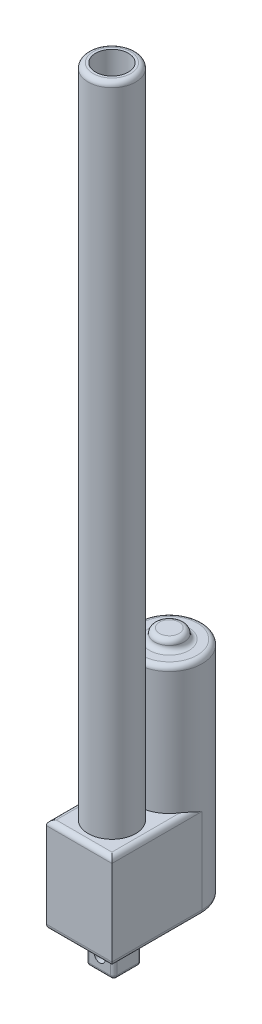
ISO-10303-21;
HEADER;
FILE_DESCRIPTION(('STEP AP214'),'2;1');
FILE_NAME('part.step','',(''),(''),'','','');
FILE_SCHEMA(('AUTOMOTIVE_DESIGN { 1 0 10303 214 1 1 1 1 }'));
ENDSEC;
DATA;
#1=APPLICATION_CONTEXT('core data for automotive mechanical design processes');
#2=APPLICATION_PROTOCOL_DEFINITION('international standard','automotive_design',2000,#1);
#3=PRODUCT_CONTEXT('',#1,'mechanical');
#4=PRODUCT('Part','Part','',(#3));
#5=PRODUCT_RELATED_PRODUCT_CATEGORY('part','',(#4));
#6=PRODUCT_DEFINITION_FORMATION('','',#4);
#7=PRODUCT_DEFINITION_CONTEXT('part definition',#1,'design');
#8=PRODUCT_DEFINITION('design','',#6,#7);
#9=PRODUCT_DEFINITION_SHAPE('','',#8);
#10=(LENGTH_UNIT() NAMED_UNIT(*) SI_UNIT(.MILLI.,.METRE.));
#11=(NAMED_UNIT(*) PLANE_ANGLE_UNIT() SI_UNIT($,.RADIAN.));
#12=(NAMED_UNIT(*) SI_UNIT($,.STERADIAN.) SOLID_ANGLE_UNIT());
#13=UNCERTAINTY_MEASURE_WITH_UNIT(LENGTH_MEASURE(1.E-05),#10,'distance_accuracy_value','');
#14=(GEOMETRIC_REPRESENTATION_CONTEXT(3) GLOBAL_UNCERTAINTY_ASSIGNED_CONTEXT((#13)) GLOBAL_UNIT_ASSIGNED_CONTEXT((#10,
#11,#12)) REPRESENTATION_CONTEXT('',''));
#15=CARTESIAN_POINT('',(0.,0.,0.));
#16=DIRECTION('',(0.,0.,1.));
#17=DIRECTION('',(1.,0.,0.));
#18=AXIS2_PLACEMENT_3D('',#15,#16,#17);
#19=CARTESIAN_POINT('',(0.,0.,0.));
#20=DIRECTION('',(0.,1.,0.));
#21=DIRECTION('',(0.,0.,1.));
#22=AXIS2_PLACEMENT_3D('',#19,#20,#21);
#23=PLANE('',#22);
#24=DIRECTION('',(0.,0.,1.));
#25=VECTOR('',#24,1.);
#26=CARTESIAN_POINT('',(-17.,0.,0.));
#27=LINE('',#26,#25);
#28=CARTESIAN_POINT('',(-17.,0.,52.));
#29=VERTEX_POINT('',#28);
#30=CARTESIAN_POINT('',(-17.,0.,0.));
#31=VERTEX_POINT('',#30);
#32=EDGE_CURVE('E378',#29,#31,#27,.F.);
#33=ORIENTED_EDGE('',*,*,#32,.T.);
#34=CARTESIAN_POINT('',(0.,0.,0.));
#35=DIRECTION('',(0.,1.,0.));
#36=DIRECTION('',(0.,0.,1.));
#37=AXIS2_PLACEMENT_3D('',#34,#35,#36);
#38=CIRCLE('',#37,17.);
#39=CARTESIAN_POINT('',(17.,0.,0.));
#40=VERTEX_POINT('',#39);
#41=EDGE_CURVE('E387',#31,#40,#38,.F.);
#42=ORIENTED_EDGE('',*,*,#41,.T.);
#43=DIRECTION('',(0.,0.,-1.));
#44=VECTOR('',#43,1.);
#45=CARTESIAN_POINT('',(17.,0.,0.));
#46=LINE('',#45,#44);
#47=CARTESIAN_POINT('',(17.,0.,52.));
#48=VERTEX_POINT('',#47);
#49=EDGE_CURVE('E385',#40,#48,#46,.F.);
#50=ORIENTED_EDGE('',*,*,#49,.T.);
#51=DIRECTION('',(1.,0.,0.));
#52=VECTOR('',#51,1.);
#53=CARTESIAN_POINT('',(0.,0.,52.));
#54=LINE('',#53,#52);
#55=EDGE_CURVE('E380',#48,#29,#54,.F.);
#56=ORIENTED_EDGE('',*,*,#55,.T.);
#57=EDGE_LOOP('',(#33,#42,#50,#56));
#58=FACE_BOUND('',#57,.T.);
#59=CARTESIAN_POINT('',(-5.40455096627243,0.,41.5));
#60=DIRECTION('',(0.,-1.,0.));
#61=DIRECTION('',(0.,0.,1.));
#62=AXIS2_PLACEMENT_3D('',#59,#60,#61);
#63=CIRCLE('',#62,2.);
#64=CARTESIAN_POINT('',(-5.40455096627242,0.,43.5));
#65=VERTEX_POINT('',#64);
#66=CARTESIAN_POINT('',(-7.40455096627243,0.,41.5));
#67=VERTEX_POINT('',#66);
#68=EDGE_CURVE('E167',#65,#67,#63,.T.);
#69=ORIENTED_EDGE('',*,*,#68,.F.);
#70=DIRECTION('',(-1.,0.,0.));
#71=VECTOR('',#70,1.);
#72=CARTESIAN_POINT('',(-5.40455096627242,0.,43.5));
#73=LINE('',#72,#71);
#74=CARTESIAN_POINT('',(7.59544903372756,0.,43.5));
#75=VERTEX_POINT('',#74);
#76=EDGE_CURVE('E172',#75,#65,#73,.T.);
#77=ORIENTED_EDGE('',*,*,#76,.F.);
#78=CARTESIAN_POINT('',(7.59544903372757,0.,41.5));
#79=DIRECTION('',(0.,-1.,0.));
#80=DIRECTION('',(0.,0.,-1.));
#81=AXIS2_PLACEMENT_3D('',#78,#79,#80);
#82=CIRCLE('',#81,2.);
#83=CARTESIAN_POINT('',(9.59544903372757,0.,41.5));
#84=VERTEX_POINT('',#83);
#85=EDGE_CURVE('E184',#84,#75,#82,.T.);
#86=ORIENTED_EDGE('',*,*,#85,.F.);
#87=DIRECTION('',(0.,0.,1.));
#88=VECTOR('',#87,1.);
#89=CARTESIAN_POINT('',(9.59544903372757,0.,41.5));
#90=LINE('',#89,#88);
#91=CARTESIAN_POINT('',(9.59544903372757,0.,28.5));
#92=VERTEX_POINT('',#91);
#93=EDGE_CURVE('E186',#92,#84,#90,.T.);
#94=ORIENTED_EDGE('',*,*,#93,.F.);
#95=CARTESIAN_POINT('',(7.59544903372757,0.,28.5));
#96=DIRECTION('',(0.,-1.,0.));
#97=DIRECTION('',(0.,0.,1.));
#98=AXIS2_PLACEMENT_3D('',#95,#96,#97);
#99=CIRCLE('',#98,2.);
#100=CARTESIAN_POINT('',(7.59544903372756,0.,26.5));
#101=VERTEX_POINT('',#100);
#102=EDGE_CURVE('E483',#101,#92,#99,.T.);
#103=ORIENTED_EDGE('',*,*,#102,.F.);
#104=DIRECTION('',(1.,0.,0.));
#105=VECTOR('',#104,1.);
#106=CARTESIAN_POINT('',(-5.40455096627242,0.,26.5));
#107=LINE('',#106,#105);
#108=CARTESIAN_POINT('',(-5.40455096627242,0.,26.5));
#109=VERTEX_POINT('',#108);
#110=EDGE_CURVE('E486',#109,#101,#107,.T.);
#111=ORIENTED_EDGE('',*,*,#110,.F.);
#112=CARTESIAN_POINT('',(-5.40455096627243,0.,28.5));
#113=DIRECTION('',(0.,-1.,0.));
#114=DIRECTION('',(0.,0.,1.));
#115=AXIS2_PLACEMENT_3D('',#112,#113,#114);
#116=CIRCLE('',#115,2.);
#117=CARTESIAN_POINT('',(-7.40455096627243,0.,28.5));
#118=VERTEX_POINT('',#117);
#119=EDGE_CURVE('E488',#118,#109,#116,.T.);
#120=ORIENTED_EDGE('',*,*,#119,.F.);
#121=DIRECTION('',(0.,0.,-1.));
#122=VECTOR('',#121,1.);
#123=CARTESIAN_POINT('',(-7.40455096627243,0.,41.5));
#124=LINE('',#123,#122);
#125=EDGE_CURVE('E181',#67,#118,#124,.T.);
#126=ORIENTED_EDGE('',*,*,#125,.F.);
#127=EDGE_LOOP('',(#69,#77,#86,#94,#103,#111,#120,#126));
#128=FACE_BOUND('',#127,.T.);
#129=ADVANCED_FACE('F38',(#58,#128),#23,.F.);
#130=CARTESIAN_POINT('',(0.,58.,0.));
#131=DIRECTION('',(0.,-1.,0.));
#132=DIRECTION('',(0.,0.,-1.));
#133=AXIS2_PLACEMENT_3D('',#130,#131,#132);
#134=CYLINDRICAL_SURFACE('',#133,20.);
#135=CARTESIAN_POINT('',(0.,133.,0.));
#136=DIRECTION('',(0.,1.,0.));
#137=DIRECTION('',(0.,0.,1.));
#138=AXIS2_PLACEMENT_3D('',#135,#136,#137);
#139=CIRCLE('',#138,20.);
#140=CARTESIAN_POINT('',(0.,133.,20.));
#141=VERTEX_POINT('',#140);
#142=EDGE_CURVE('E409',#141,#141,#139,.F.);
#143=ORIENTED_EDGE('',*,*,#142,.T.);
#144=EDGE_LOOP('',(#143));
#145=FACE_BOUND('',#144,.T.);
#146=DIRECTION('',(0.,-1.,0.));
#147=VECTOR('',#146,1.);
#148=CARTESIAN_POINT('',(20.,58.,0.));
#149=LINE('',#148,#147);
#150=CARTESIAN_POINT('',(20.,55.,0.));
#151=VERTEX_POINT('',#150);
#152=CARTESIAN_POINT('',(20.,3.00000000000002,0.));
#153=VERTEX_POINT('',#152);
#154=EDGE_CURVE('E214',#151,#153,#149,.T.);
#155=ORIENTED_EDGE('',*,*,#154,.T.);
#156=CARTESIAN_POINT('',(0.,3.,0.));
#157=DIRECTION('',(0.,1.,0.));
#158=DIRECTION('',(0.,0.,1.));
#159=AXIS2_PLACEMENT_3D('',#156,#157,#158);
#160=CIRCLE('',#159,20.);
#161=CARTESIAN_POINT('',(-20.,3.00000000000002,0.));
#162=VERTEX_POINT('',#161);
#163=EDGE_CURVE('E374',#153,#162,#160,.T.);
#164=ORIENTED_EDGE('',*,*,#163,.T.);
#165=DIRECTION('',(0.,-1.,0.));
#166=VECTOR('',#165,1.);
#167=CARTESIAN_POINT('',(-20.,58.,0.));
#168=LINE('',#167,#166);
#169=CARTESIAN_POINT('',(-20.,55.,0.));
#170=VERTEX_POINT('',#169);
#171=EDGE_CURVE('E219',#170,#162,#168,.T.);
#172=ORIENTED_EDGE('',*,*,#171,.F.);
#173=CARTESIAN_POINT('',(-17.,58.,10.5356537528527));
#174=CARTESIAN_POINT('',(-17.0895448022673,57.9999782410106,10.3911760778153));
#175=CARTESIAN_POINT('',(-17.1772185302614,57.995992018961,10.2455863992191));
#176=CARTESIAN_POINT('',(-17.3486422294934,57.9809194274149,9.95255556602213));
#177=CARTESIAN_POINT('',(-17.4323938846708,57.9698361355971,9.80511524112177));
#178=CARTESIAN_POINT('',(-17.5956876618835,57.9414283994052,9.50896002125828));
#179=CARTESIAN_POINT('',(-17.675238743086,57.9241179088912,9.36024869594975));
#180=CARTESIAN_POINT('',(-17.8302672611487,57.8839326824874,9.0614516431863));
#181=CARTESIAN_POINT('',(-17.9057441981785,57.8610572657603,8.91136574972452));
#182=CARTESIAN_POINT('',(-18.1251502858539,57.7853030348798,8.46108504584103));
#183=CARTESIAN_POINT('',(-18.2630104972366,57.7251149668963,8.15913048456194));
#184=CARTESIAN_POINT('',(-18.5224881765929,57.5891109541304,7.55160111752511));
#185=CARTESIAN_POINT('',(-18.6440929993286,57.513282958146,7.24602369236116));
#186=CARTESIAN_POINT('',(-18.8490527869545,57.3651060229508,6.69198454232564));
#187=CARTESIAN_POINT('',(-18.9352466017832,57.2949501669699,6.44397665599419));
#188=CARTESIAN_POINT('',(-19.0972922428552,57.1478676851181,5.94658382503359));
#189=CARTESIAN_POINT('',(-19.1731428622616,57.0709402708668,5.6971987232381));
#190=CARTESIAN_POINT('',(-19.3854166699556,56.8317433902614,4.94728357596335));
#191=CARTESIAN_POINT('',(-19.5065484481745,56.6610693305168,4.44502999160686));
#192=CARTESIAN_POINT('',(-19.709172391863,56.3047789821685,3.43705349427391));
#193=CARTESIAN_POINT('',(-19.7905979120841,56.1191381768188,2.93132618336807));
#194=CARTESIAN_POINT('',(-19.9142998143184,55.7393940275859,1.91852913864081));
#195=CARTESIAN_POINT('',(-19.9565950479971,55.5452948059293,1.41146016939251));
#196=CARTESIAN_POINT('',(-19.9927901364862,55.2368646054805,0.611622144785783));
#197=CARTESIAN_POINT('',(-19.9995967530798,55.1235441690785,0.318990849644172));
#198=CARTESIAN_POINT('',(-19.9999942018716,55.0068100482986,0.017583467208841));
#199=CARTESIAN_POINT('',(-19.9999999988693,55.0034050213477,0.00879172538854799));
#200=CARTESIAN_POINT('',(-20.,55.,0.));
#201=B_SPLINE_CURVE_WITH_KNOTS('',3,(#173,#174,#175,#176,#177,#178,#179,#180,#181,#182,#183,
#184,#185,#186,#187,#188,#189,#190,#191,#192,#193,#194,#195,#196,#197,#198,#199,#200),
.UNSPECIFIED.,.F.,.F.,(4,2,2,2,2,2,2,2,2,2,2,2,2,4),(0.,0.509811439877447,1.01940194713635,
1.52785760886553,2.03637550860506,3.04745631521841,4.05931913100926,4.87432922119133,
5.68943432496279,7.31976401305429,8.95282080045307,10.5850904253084,11.5264747571759,
11.5547590337701),.UNSPECIFIED.);
#202=CARTESIAN_POINT('',(-17.,58.,10.5356537528527));
#203=VERTEX_POINT('',#202);
#204=EDGE_CURVE('E250',#170,#203,#201,.F.);
#205=ORIENTED_EDGE('',*,*,#204,.T.);
#206=CARTESIAN_POINT('',(0.,58.,0.));
#207=DIRECTION('',(0.,1.,0.));
#208=DIRECTION('',(0.,0.,1.));
#209=AXIS2_PLACEMENT_3D('',#206,#207,#208);
#210=CIRCLE('',#209,20.);
#211=CARTESIAN_POINT('',(17.,58.,10.5356537528527));
#212=VERTEX_POINT('',#211);
#213=EDGE_CURVE('E215',#203,#212,#210,.T.);
#214=ORIENTED_EDGE('',*,*,#213,.T.);
#215=CARTESIAN_POINT('',(17.,58.,10.5356537528527));
#216=CARTESIAN_POINT('',(17.0895448022673,57.9999782410106,10.3911760778153));
#217=CARTESIAN_POINT('',(17.1772185302614,57.995992018961,10.2455863992191));
#218=CARTESIAN_POINT('',(17.3486422294934,57.9809194274149,9.95255556602213));
#219=CARTESIAN_POINT('',(17.4323938846708,57.9698361355971,9.80511524112177));
#220=CARTESIAN_POINT('',(17.5956876618835,57.9414283994052,9.50896002125828));
#221=CARTESIAN_POINT('',(17.675238743086,57.9241179088912,9.36024869594975));
#222=CARTESIAN_POINT('',(17.8302672611487,57.8839326824874,9.0614516431863));
#223=CARTESIAN_POINT('',(17.9057441981785,57.8610572657603,8.91136574972452));
#224=CARTESIAN_POINT('',(18.1251502858539,57.7853030348798,8.46108504584103));
#225=CARTESIAN_POINT('',(18.2630104972366,57.7251149668963,8.15913048456194));
#226=CARTESIAN_POINT('',(18.5224881765929,57.5891109541304,7.55160111752511));
#227=CARTESIAN_POINT('',(18.6440929993286,57.513282958146,7.24602369236116));
#228=CARTESIAN_POINT('',(18.8490527869545,57.3651060229508,6.69198454232564));
#229=CARTESIAN_POINT('',(18.9352466017832,57.2949501669699,6.44397665599419));
#230=CARTESIAN_POINT('',(19.0972922428552,57.1478676851181,5.94658382503359));
#231=CARTESIAN_POINT('',(19.1731428622616,57.0709402708668,5.6971987232381));
#232=CARTESIAN_POINT('',(19.3854166699556,56.8317433902614,4.94728357596335));
#233=CARTESIAN_POINT('',(19.5065484481745,56.6610693305168,4.44502999160686));
#234=CARTESIAN_POINT('',(19.709172391863,56.3047789821685,3.43705349427391));
#235=CARTESIAN_POINT('',(19.7905979120841,56.1191381768188,2.93132618336807));
#236=CARTESIAN_POINT('',(19.9142998143184,55.7393940275859,1.91852913864081));
#237=CARTESIAN_POINT('',(19.9565950479971,55.5452948059293,1.41146016939251));
#238=CARTESIAN_POINT('',(19.9927901364862,55.2368646054805,0.611622144785783));
#239=CARTESIAN_POINT('',(19.9995967530798,55.1235441690785,0.318990849644172));
#240=CARTESIAN_POINT('',(19.9999942018716,55.0068100482986,0.017583467208841));
#241=CARTESIAN_POINT('',(19.9999999988693,55.0034050213477,0.00879172538854799));
#242=CARTESIAN_POINT('',(20.,55.,0.));
#243=B_SPLINE_CURVE_WITH_KNOTS('',3,(#215,#216,#217,#218,#219,#220,#221,#222,#223,#224,#225,
#226,#227,#228,#229,#230,#231,#232,#233,#234,#235,#236,#237,#238,#239,#240,#241,#242),
.UNSPECIFIED.,.F.,.F.,(4,2,2,2,2,2,2,2,2,2,2,2,2,4),(0.,0.509811439877447,1.01940194713635,
1.52785760886553,2.03637550860506,3.04745631521841,4.05931913100926,4.87432922119133,
5.68943432496279,7.31976401305429,8.95282080045307,10.5850904253084,11.5264747571759,
11.5547590337701),.UNSPECIFIED.);
#244=EDGE_CURVE('E242',#212,#151,#243,.T.);
#245=ORIENTED_EDGE('',*,*,#244,.T.);
#246=EDGE_LOOP('',(#155,#164,#172,#205,#214,#245));
#247=FACE_BOUND('',#246,.T.);
#248=ADVANCED_FACE('F257',(#145,#247),#134,.T.);
#249=CARTESIAN_POINT('',(-20.,58.,0.));
#250=DIRECTION('',(1.,0.,0.));
#251=DIRECTION('',(0.,0.,-1.));
#252=AXIS2_PLACEMENT_3D('',#249,#250,#251);
#253=PLANE('',#252);
#254=ORIENTED_EDGE('',*,*,#171,.T.);
#255=DIRECTION('',(0.,0.,1.));
#256=VECTOR('',#255,1.);
#257=CARTESIAN_POINT('',(-20.,3.,0.));
#258=LINE('',#257,#256);
#259=CARTESIAN_POINT('',(-20.,3.00000000000002,55.));
#260=VERTEX_POINT('',#259);
#261=EDGE_CURVE('E367',#162,#260,#258,.T.);
#262=ORIENTED_EDGE('',*,*,#261,.T.);
#263=DIRECTION('',(0.,-1.,0.));
#264=VECTOR('',#263,1.);
#265=CARTESIAN_POINT('',(-20.,58.,55.));
#266=LINE('',#265,#264);
#267=CARTESIAN_POINT('',(-20.,55.,55.));
#268=VERTEX_POINT('',#267);
#269=EDGE_CURVE('E225',#268,#260,#266,.T.);
#270=ORIENTED_EDGE('',*,*,#269,.F.);
#271=DIRECTION('',(0.,0.,1.));
#272=VECTOR('',#271,1.);
#273=CARTESIAN_POINT('',(-20.,55.,0.));
#274=LINE('',#273,#272);
#275=EDGE_CURVE('E240',#268,#170,#274,.F.);
#276=ORIENTED_EDGE('',*,*,#275,.T.);
#277=EDGE_LOOP('',(#254,#262,#270,#276));
#278=FACE_BOUND('',#277,.T.);
#279=ADVANCED_FACE('F346',(#278),#253,.F.);
#280=CARTESIAN_POINT('',(-20.,58.,55.));
#281=DIRECTION('',(0.,0.,-1.));
#282=DIRECTION('',(-1.,0.,0.));
#283=AXIS2_PLACEMENT_3D('',#280,#281,#282);
#284=PLANE('',#283);
#285=ORIENTED_EDGE('',*,*,#269,.T.);
#286=DIRECTION('',(1.,0.,0.));
#287=VECTOR('',#286,1.);
#288=CARTESIAN_POINT('',(-20.,3.,55.));
#289=LINE('',#288,#287);
#290=CARTESIAN_POINT('',(20.,3.00000000000002,55.));
#291=VERTEX_POINT('',#290);
#292=EDGE_CURVE('E392',#260,#291,#289,.T.);
#293=ORIENTED_EDGE('',*,*,#292,.T.);
#294=DIRECTION('',(0.,-1.,0.));
#295=VECTOR('',#294,1.);
#296=CARTESIAN_POINT('',(20.,58.,55.));
#297=LINE('',#296,#295);
#298=CARTESIAN_POINT('',(20.,55.,55.));
#299=VERTEX_POINT('',#298);
#300=EDGE_CURVE('E222',#299,#291,#297,.T.);
#301=ORIENTED_EDGE('',*,*,#300,.F.);
#302=DIRECTION('',(1.,0.,0.));
#303=VECTOR('',#302,1.);
#304=CARTESIAN_POINT('',(-20.,55.,55.));
#305=LINE('',#304,#303);
#306=EDGE_CURVE('E236',#299,#268,#305,.F.);
#307=ORIENTED_EDGE('',*,*,#306,.T.);
#308=EDGE_LOOP('',(#285,#293,#301,#307));
#309=FACE_BOUND('',#308,.T.);
#310=ADVANCED_FACE('F355',(#309),#284,.F.);
#311=CARTESIAN_POINT('',(20.,58.,0.));
#312=DIRECTION('',(-1.,0.,0.));
#313=DIRECTION('',(0.,0.,1.));
#314=AXIS2_PLACEMENT_3D('',#311,#312,#313);
#315=PLANE('',#314);
#316=ORIENTED_EDGE('',*,*,#300,.T.);
#317=DIRECTION('',(0.,0.,-1.));
#318=VECTOR('',#317,1.);
#319=CARTESIAN_POINT('',(20.,3.,0.));
#320=LINE('',#319,#318);
#321=EDGE_CURVE('E390',#291,#153,#320,.T.);
#322=ORIENTED_EDGE('',*,*,#321,.T.);
#323=ORIENTED_EDGE('',*,*,#154,.F.);
#324=DIRECTION('',(0.,0.,-1.));
#325=VECTOR('',#324,1.);
#326=CARTESIAN_POINT('',(20.,55.,55.));
#327=LINE('',#326,#325);
#328=EDGE_CURVE('E238',#151,#299,#327,.F.);
#329=ORIENTED_EDGE('',*,*,#328,.T.);
#330=EDGE_LOOP('',(#316,#322,#323,#329));
#331=FACE_BOUND('',#330,.T.);
#332=ADVANCED_FACE('F352',(#331),#315,.F.);
#333=CARTESIAN_POINT('',(0.,58.,0.));
#334=DIRECTION('',(0.,1.,0.));
#335=DIRECTION('',(0.,0.,1.));
#336=AXIS2_PLACEMENT_3D('',#333,#334,#335);
#337=PLANE('',#336);
#338=CARTESIAN_POINT('',(0.,58.,35.));
#339=DIRECTION('',(0.,1.,0.));
#340=DIRECTION('',(0.,0.,1.));
#341=AXIS2_PLACEMENT_3D('',#338,#339,#340);
#342=CIRCLE('',#341,14.5);
#343=CARTESIAN_POINT('',(0.,58.,49.5));
#344=VERTEX_POINT('',#343);
#345=EDGE_CURVE('E207',#344,#344,#342,.T.);
#346=ORIENTED_EDGE('',*,*,#345,.F.);
#347=EDGE_LOOP('',(#346));
#348=FACE_BOUND('',#347,.T.);
#349=DIRECTION('',(1.,0.,0.));
#350=VECTOR('',#349,1.);
#351=CARTESIAN_POINT('',(20.,58.,52.));
#352=LINE('',#351,#350);
#353=CARTESIAN_POINT('',(-17.,58.,52.));
#354=VERTEX_POINT('',#353);
#355=CARTESIAN_POINT('',(17.,58.,52.));
#356=VERTEX_POINT('',#355);
#357=EDGE_CURVE('E231',#354,#356,#352,.T.);
#358=ORIENTED_EDGE('',*,*,#357,.T.);
#359=DIRECTION('',(0.,0.,-1.));
#360=VECTOR('',#359,1.);
#361=CARTESIAN_POINT('',(17.,58.,0.));
#362=LINE('',#361,#360);
#363=EDGE_CURVE('E234',#356,#212,#362,.T.);
#364=ORIENTED_EDGE('',*,*,#363,.T.);
#365=ORIENTED_EDGE('',*,*,#213,.F.);
#366=DIRECTION('',(0.,0.,1.));
#367=VECTOR('',#366,1.);
#368=CARTESIAN_POINT('',(-17.,58.,55.));
#369=LINE('',#368,#367);
#370=EDGE_CURVE('E218',#203,#354,#369,.T.);
#371=ORIENTED_EDGE('',*,*,#370,.T.);
#372=EDGE_LOOP('',(#358,#364,#365,#371));
#373=FACE_BOUND('',#372,.T.);
#374=ADVANCED_FACE('F350',(#348,#373),#337,.T.);
#375=CARTESIAN_POINT('',(0.,136.,0.));
#376=DIRECTION('',(0.,1.,0.));
#377=DIRECTION('',(0.,0.,1.));
#378=AXIS2_PLACEMENT_3D('',#375,#376,#377);
#379=PLANE('',#378);
#380=CARTESIAN_POINT('',(0.,136.,0.));
#381=DIRECTION('',(0.,1.,0.));
#382=DIRECTION('',(0.,0.,1.));
#383=AXIS2_PLACEMENT_3D('',#380,#381,#382);
#384=CIRCLE('',#383,12.);
#385=CARTESIAN_POINT('',(0.,136.,12.));
#386=VERTEX_POINT('',#385);
#387=EDGE_CURVE('E415',#386,#386,#384,.F.);
#388=ORIENTED_EDGE('',*,*,#387,.T.);
#389=EDGE_LOOP('',(#388));
#390=FACE_BOUND('',#389,.T.);
#391=CARTESIAN_POINT('',(0.,136.,0.));
#392=DIRECTION('',(0.,1.,0.));
#393=DIRECTION('',(0.,0.,1.));
#394=AXIS2_PLACEMENT_3D('',#391,#392,#393);
#395=CIRCLE('',#394,17.);
#396=CARTESIAN_POINT('',(0.,136.,17.));
#397=VERTEX_POINT('',#396);
#398=EDGE_CURVE('E395',#397,#397,#395,.T.);
#399=ORIENTED_EDGE('',*,*,#398,.T.);
#400=EDGE_LOOP('',(#399));
#401=FACE_BOUND('',#400,.T.);
#402=ADVANCED_FACE('F548',(#390,#401),#379,.T.);
#403=CARTESIAN_POINT('',(0.,458.,35.));
#404=DIRECTION('',(0.,-1.,0.));
#405=DIRECTION('',(0.,0.,-1.));
#406=AXIS2_PLACEMENT_3D('',#403,#404,#405);
#407=CYLINDRICAL_SURFACE('',#406,14.5);
#408=CARTESIAN_POINT('',(0.,455.,35.));
#409=DIRECTION('',(0.,1.,0.));
#410=DIRECTION('',(0.,0.,1.));
#411=AXIS2_PLACEMENT_3D('',#408,#409,#410);
#412=CIRCLE('',#411,14.5);
#413=CARTESIAN_POINT('',(0.,455.,49.5));
#414=VERTEX_POINT('',#413);
#415=EDGE_CURVE('E423',#414,#414,#412,.F.);
#416=ORIENTED_EDGE('',*,*,#415,.T.);
#417=EDGE_LOOP('',(#416));
#418=FACE_BOUND('',#417,.T.);
#419=ORIENTED_EDGE('',*,*,#345,.T.);
#420=EDGE_LOOP('',(#419));
#421=FACE_BOUND('',#420,.T.);
#422=ADVANCED_FACE('F545',(#418,#421),#407,.T.);
#423=CARTESIAN_POINT('',(0.,458.,35.));
#424=DIRECTION('',(0.,1.,0.));
#425=DIRECTION('',(0.,0.,1.));
#426=AXIS2_PLACEMENT_3D('',#423,#424,#425);
#427=PLANE('',#426);
#428=CARTESIAN_POINT('',(0.,458.,35.));
#429=DIRECTION('',(0.,1.,0.));
#430=DIRECTION('',(0.,0.,1.));
#431=AXIS2_PLACEMENT_3D('',#428,#429,#430);
#432=CIRCLE('',#431,11.5);
#433=CARTESIAN_POINT('',(0.,458.,46.5));
#434=VERTEX_POINT('',#433);
#435=EDGE_CURVE('E418',#434,#434,#432,.T.);
#436=ORIENTED_EDGE('',*,*,#435,.T.);
#437=EDGE_LOOP('',(#436));
#438=FACE_BOUND('',#437,.T.);
#439=CARTESIAN_POINT('',(0.,458.,35.));
#440=DIRECTION('',(0.,1.,0.));
#441=DIRECTION('',(0.,0.,1.));
#442=AXIS2_PLACEMENT_3D('',#439,#440,#441);
#443=CIRCLE('',#442,10.);
#444=CARTESIAN_POINT('',(0.,458.,45.));
#445=VERTEX_POINT('',#444);
#446=EDGE_CURVE('E208',#445,#445,#443,.T.);
#447=ORIENTED_EDGE('',*,*,#446,.F.);
#448=EDGE_LOOP('',(#447));
#449=FACE_BOUND('',#448,.T.);
#450=ADVANCED_FACE('F541',(#438,#449),#427,.T.);
#451=CARTESIAN_POINT('',(0.,158.,35.));
#452=DIRECTION('',(0.,1.,0.));
#453=DIRECTION('',(0.,0.,1.));
#454=AXIS2_PLACEMENT_3D('',#451,#452,#453);
#455=CYLINDRICAL_SURFACE('',#454,10.);
#456=CARTESIAN_POINT('',(0.,158.,35.));
#457=DIRECTION('',(0.,1.,0.));
#458=DIRECTION('',(0.,0.,1.));
#459=AXIS2_PLACEMENT_3D('',#456,#457,#458);
#460=CIRCLE('',#459,10.);
#461=CARTESIAN_POINT('',(0.,158.,45.));
#462=VERTEX_POINT('',#461);
#463=EDGE_CURVE('E204',#462,#462,#460,.T.);
#464=ORIENTED_EDGE('',*,*,#463,.F.);
#465=EDGE_LOOP('',(#464));
#466=FACE_BOUND('',#465,.T.);
#467=ORIENTED_EDGE('',*,*,#446,.T.);
#468=EDGE_LOOP('',(#467));
#469=FACE_BOUND('',#468,.T.);
#470=ADVANCED_FACE('F537',(#466,#469),#455,.F.);
#471=CARTESIAN_POINT('',(0.,158.,35.));
#472=DIRECTION('',(0.,1.,0.));
#473=DIRECTION('',(0.,0.,1.));
#474=AXIS2_PLACEMENT_3D('',#471,#472,#473);
#475=PLANE('',#474);
#476=ORIENTED_EDGE('',*,*,#463,.T.);
#477=EDGE_LOOP('',(#476));
#478=FACE_BOUND('',#477,.T.);
#479=ADVANCED_FACE('F270',(#478),#475,.T.);
#480=CARTESIAN_POINT('',(-17.,55.,0.));
#481=DIRECTION('',(0.,0.,-1.));
#482=DIRECTION('',(-1.,0.,0.));
#483=AXIS2_PLACEMENT_3D('',#480,#481,#482);
#484=CYLINDRICAL_SURFACE('',#483,3.);
#485=ORIENTED_EDGE('',*,*,#204,.F.);
#486=ORIENTED_EDGE('',*,*,#275,.F.);
#487=CARTESIAN_POINT('',(-17.,55.,52.));
#488=DIRECTION('',(-0.707106781186547,0.,-0.707106781186547));
#489=DIRECTION('',(0.707106781186547,0.,-0.707106781186547));
#490=AXIS2_PLACEMENT_3D('',#487,#488,#489);
#491=ELLIPSE('',#490,4.24264068711928,3.);
#492=EDGE_CURVE('E211',#354,#268,#491,.F.);
#493=ORIENTED_EDGE('',*,*,#492,.F.);
#494=ORIENTED_EDGE('',*,*,#370,.F.);
#495=EDGE_LOOP('',(#485,#486,#493,#494));
#496=FACE_BOUND('',#495,.T.);
#497=ADVANCED_FACE('F265',(#496),#484,.T.);
#498=CARTESIAN_POINT('',(17.,55.,0.));
#499=DIRECTION('',(0.,0.,1.));
#500=DIRECTION('',(1.,0.,0.));
#501=AXIS2_PLACEMENT_3D('',#498,#499,#500);
#502=CYLINDRICAL_SURFACE('',#501,3.);
#503=ORIENTED_EDGE('',*,*,#244,.F.);
#504=ORIENTED_EDGE('',*,*,#363,.F.);
#505=CARTESIAN_POINT('',(17.,55.,52.));
#506=DIRECTION('',(-0.707106781186547,0.,0.707106781186547));
#507=DIRECTION('',(0.707106781186547,0.,0.707106781186547));
#508=AXIS2_PLACEMENT_3D('',#505,#506,#507);
#509=ELLIPSE('',#508,4.24264068711928,3.);
#510=EDGE_CURVE('E406',#299,#356,#509,.T.);
#511=ORIENTED_EDGE('',*,*,#510,.F.);
#512=ORIENTED_EDGE('',*,*,#328,.F.);
#513=EDGE_LOOP('',(#503,#504,#511,#512));
#514=FACE_BOUND('',#513,.T.);
#515=ADVANCED_FACE('F261',(#514),#502,.T.);
#516=CARTESIAN_POINT('',(0.,55.,52.));
#517=DIRECTION('',(-1.,0.,0.));
#518=DIRECTION('',(0.,0.,1.));
#519=AXIS2_PLACEMENT_3D('',#516,#517,#518);
#520=CYLINDRICAL_SURFACE('',#519,3.);
#521=ORIENTED_EDGE('',*,*,#492,.T.);
#522=ORIENTED_EDGE('',*,*,#306,.F.);
#523=ORIENTED_EDGE('',*,*,#510,.T.);
#524=ORIENTED_EDGE('',*,*,#357,.F.);
#525=EDGE_LOOP('',(#521,#522,#523,#524));
#526=FACE_BOUND('',#525,.T.);
#527=ADVANCED_FACE('F264',(#526),#520,.T.);
#528=CARTESIAN_POINT('',(-20.,3.,52.));
#529=DIRECTION('',(1.,0.,0.));
#530=DIRECTION('',(0.,0.,-1.));
#531=AXIS2_PLACEMENT_3D('',#528,#529,#530);
#532=CYLINDRICAL_SURFACE('',#531,3.);
#533=CARTESIAN_POINT('',(-17.,3.,52.));
#534=DIRECTION('',(0.707106781186547,0.,0.707106781186547));
#535=DIRECTION('',(-0.707106781186547,0.,0.707106781186547));
#536=AXIS2_PLACEMENT_3D('',#533,#534,#535);
#537=ELLIPSE('',#536,4.24264068711928,3.);
#538=EDGE_CURVE('E400',#29,#260,#537,.F.);
#539=ORIENTED_EDGE('',*,*,#538,.F.);
#540=ORIENTED_EDGE('',*,*,#55,.F.);
#541=CARTESIAN_POINT('',(17.,3.,52.));
#542=DIRECTION('',(0.707106781186547,0.,-0.707106781186547));
#543=DIRECTION('',(0.707106781186547,0.,0.707106781186547));
#544=AXIS2_PLACEMENT_3D('',#541,#542,#543);
#545=ELLIPSE('',#544,4.24264068711928,3.);
#546=EDGE_CURVE('E403',#291,#48,#545,.T.);
#547=ORIENTED_EDGE('',*,*,#546,.F.);
#548=ORIENTED_EDGE('',*,*,#292,.F.);
#549=EDGE_LOOP('',(#539,#540,#547,#548));
#550=FACE_BOUND('',#549,.T.);
#551=ADVANCED_FACE('F284',(#550),#532,.T.);
#552=CARTESIAN_POINT('',(17.,3.,0.));
#553=DIRECTION('',(0.,0.,-1.));
#554=DIRECTION('',(-1.,0.,0.));
#555=AXIS2_PLACEMENT_3D('',#552,#553,#554);
#556=CYLINDRICAL_SURFACE('',#555,3.);
#557=ORIENTED_EDGE('',*,*,#546,.T.);
#558=ORIENTED_EDGE('',*,*,#49,.F.);
#559=CARTESIAN_POINT('',(17.,3.,0.));
#560=DIRECTION('',(0.,0.,-1.));
#561=DIRECTION('',(-1.,0.,0.));
#562=AXIS2_PLACEMENT_3D('',#559,#560,#561);
#563=CIRCLE('',#562,3.);
#564=EDGE_CURVE('E398',#153,#40,#563,.T.);
#565=ORIENTED_EDGE('',*,*,#564,.F.);
#566=ORIENTED_EDGE('',*,*,#321,.F.);
#567=EDGE_LOOP('',(#557,#558,#565,#566));
#568=FACE_BOUND('',#567,.T.);
#569=ADVANCED_FACE('F280',(#568),#556,.T.);
#570=CARTESIAN_POINT('',(-17.,3.,0.));
#571=DIRECTION('',(0.,0.,1.));
#572=DIRECTION('',(1.,0.,0.));
#573=AXIS2_PLACEMENT_3D('',#570,#571,#572);
#574=CYLINDRICAL_SURFACE('',#573,3.);
#575=ORIENTED_EDGE('',*,*,#538,.T.);
#576=ORIENTED_EDGE('',*,*,#261,.F.);
#577=CARTESIAN_POINT('',(-17.,3.,0.));
#578=DIRECTION('',(0.,0.,-1.));
#579=DIRECTION('',(-1.,0.,0.));
#580=AXIS2_PLACEMENT_3D('',#577,#578,#579);
#581=CIRCLE('',#580,3.);
#582=EDGE_CURVE('E396',#31,#162,#581,.T.);
#583=ORIENTED_EDGE('',*,*,#582,.F.);
#584=ORIENTED_EDGE('',*,*,#32,.F.);
#585=EDGE_LOOP('',(#575,#576,#583,#584));
#586=FACE_BOUND('',#585,.T.);
#587=ADVANCED_FACE('F276',(#586),#574,.T.);
#588=CARTESIAN_POINT('',(0.,3.,0.));
#589=DIRECTION('',(0.,1.,0.));
#590=DIRECTION('',(0.,0.,1.));
#591=AXIS2_PLACEMENT_3D('',#588,#589,#590);
#592=TOROIDAL_SURFACE('',#591,17.,3.);
#593=ORIENTED_EDGE('',*,*,#564,.T.);
#594=ORIENTED_EDGE('',*,*,#41,.F.);
#595=ORIENTED_EDGE('',*,*,#582,.T.);
#596=ORIENTED_EDGE('',*,*,#163,.F.);
#597=EDGE_LOOP('',(#593,#594,#595,#596));
#598=FACE_BOUND('',#597,.T.);
#599=ADVANCED_FACE('F272',(#598),#592,.T.);
#600=CARTESIAN_POINT('',(0.,133.,0.));
#601=DIRECTION('',(0.,1.,0.));
#602=DIRECTION('',(0.,0.,1.));
#603=AXIS2_PLACEMENT_3D('',#600,#601,#602);
#604=TOROIDAL_SURFACE('',#603,17.,3.);
#605=ORIENTED_EDGE('',*,*,#142,.F.);
#606=EDGE_LOOP('',(#605));
#607=FACE_BOUND('',#606,.T.);
#608=ORIENTED_EDGE('',*,*,#398,.F.);
#609=EDGE_LOOP('',(#608));
#610=FACE_BOUND('',#609,.T.);
#611=ADVANCED_FACE('F275',(#607,#610),#604,.T.);
#612=CARTESIAN_POINT('',(0.,142.,0.));
#613=DIRECTION('',(0.,1.,0.));
#614=DIRECTION('',(0.,0.,1.));
#615=AXIS2_PLACEMENT_3D('',#612,#613,#614);
#616=PLANE('',#615);
#617=CARTESIAN_POINT('',(0.,142.,0.));
#618=DIRECTION('',(0.,1.,0.));
#619=DIRECTION('',(0.,0.,1.));
#620=AXIS2_PLACEMENT_3D('',#617,#618,#619);
#621=CIRCLE('',#620,6.);
#622=CARTESIAN_POINT('',(0.,142.,6.));
#623=VERTEX_POINT('',#622);
#624=EDGE_CURVE('E412',#623,#623,#621,.T.);
#625=ORIENTED_EDGE('',*,*,#624,.T.);
#626=EDGE_LOOP('',(#625));
#627=FACE_BOUND('',#626,.T.);
#628=ADVANCED_FACE('F291',(#627),#616,.T.);
#629=CARTESIAN_POINT('',(0.,139.,0.));
#630=DIRECTION('',(0.,1.,0.));
#631=DIRECTION('',(0.,0.,1.));
#632=AXIS2_PLACEMENT_3D('',#629,#630,#631);
#633=TOROIDAL_SURFACE('',#632,12.,3.);
#634=ORIENTED_EDGE('',*,*,#387,.F.);
#635=EDGE_LOOP('',(#634));
#636=FACE_BOUND('',#635,.T.);
#637=CARTESIAN_POINT('',(0.,139.,0.));
#638=DIRECTION('',(0.,1.,0.));
#639=DIRECTION('',(0.,0.,1.));
#640=AXIS2_PLACEMENT_3D('',#637,#638,#639);
#641=CIRCLE('',#640,9.);
#642=CARTESIAN_POINT('',(0.,139.,9.));
#643=VERTEX_POINT('',#642);
#644=EDGE_CURVE('E203',#643,#643,#641,.T.);
#645=ORIENTED_EDGE('',*,*,#644,.F.);
#646=EDGE_LOOP('',(#645));
#647=FACE_BOUND('',#646,.T.);
#648=ADVANCED_FACE('F297',(#636,#647),#633,.F.);
#649=CARTESIAN_POINT('',(0.,139.,0.));
#650=DIRECTION('',(0.,1.,0.));
#651=DIRECTION('',(0.,0.,1.));
#652=AXIS2_PLACEMENT_3D('',#649,#650,#651);
#653=TOROIDAL_SURFACE('',#652,6.,3.);
#654=ORIENTED_EDGE('',*,*,#644,.T.);
#655=EDGE_LOOP('',(#654));
#656=FACE_BOUND('',#655,.T.);
#657=ORIENTED_EDGE('',*,*,#624,.F.);
#658=EDGE_LOOP('',(#657));
#659=FACE_BOUND('',#658,.T.);
#660=ADVANCED_FACE('F293',(#656,#659),#653,.T.);
#661=CARTESIAN_POINT('',(0.,455.,35.));
#662=DIRECTION('',(0.,1.,0.));
#663=DIRECTION('',(0.,0.,1.));
#664=AXIS2_PLACEMENT_3D('',#661,#662,#663);
#665=TOROIDAL_SURFACE('',#664,11.5,3.);
#666=ORIENTED_EDGE('',*,*,#415,.F.);
#667=EDGE_LOOP('',(#666));
#668=FACE_BOUND('',#667,.T.);
#669=ORIENTED_EDGE('',*,*,#435,.F.);
#670=EDGE_LOOP('',(#669));
#671=FACE_BOUND('',#670,.T.);
#672=ADVANCED_FACE('F296',(#668,#671),#665,.T.);
#673=CARTESIAN_POINT('',(-5.40455096627243,-18.,41.5));
#674=DIRECTION('',(0.,1.,0.));
#675=DIRECTION('',(0.,0.,1.));
#676=AXIS2_PLACEMENT_3D('',#673,#674,#675);
#677=CYLINDRICAL_SURFACE('',#676,2.);
#678=DIRECTION('',(0.,1.,0.));
#679=VECTOR('',#678,1.);
#680=CARTESIAN_POINT('',(-7.40455096627243,-18.,41.5));
#681=LINE('',#680,#679);
#682=CARTESIAN_POINT('',(-7.40455096627243,-16.,41.5));
#683=VERTEX_POINT('',#682);
#684=EDGE_CURVE('E201',#683,#67,#681,.T.);
#685=ORIENTED_EDGE('',*,*,#684,.F.);
#686=CARTESIAN_POINT('',(-5.40455096627243,-16.,41.5));
#687=DIRECTION('',(0.,1.,0.));
#688=DIRECTION('',(0.,0.,1.));
#689=AXIS2_PLACEMENT_3D('',#686,#687,#688);
#690=CIRCLE('',#689,2.);
#691=CARTESIAN_POINT('',(-5.40455096627242,-16.,43.5));
#692=VERTEX_POINT('',#691);
#693=EDGE_CURVE('E169',#683,#692,#690,.T.);
#694=ORIENTED_EDGE('',*,*,#693,.T.);
#695=DIRECTION('',(0.,1.,0.));
#696=VECTOR('',#695,1.);
#697=CARTESIAN_POINT('',(-5.40455096627242,-18.,43.5));
#698=LINE('',#697,#696);
#699=EDGE_CURVE('E163',#692,#65,#698,.T.);
#700=ORIENTED_EDGE('',*,*,#699,.T.);
#701=ORIENTED_EDGE('',*,*,#68,.T.);
#702=EDGE_LOOP('',(#685,#694,#700,#701));
#703=FACE_BOUND('',#702,.T.);
#704=ADVANCED_FACE('F166',(#703),#677,.T.);
#705=CARTESIAN_POINT('',(-7.40455096627243,-18.,41.5));
#706=DIRECTION('',(1.,0.,0.));
#707=DIRECTION('',(0.,0.,-1.));
#708=AXIS2_PLACEMENT_3D('',#705,#706,#707);
#709=PLANE('',#708);
#710=DIRECTION('',(0.,1.,0.));
#711=VECTOR('',#710,1.);
#712=CARTESIAN_POINT('',(-7.40455096627243,-18.,28.5));
#713=LINE('',#712,#711);
#714=CARTESIAN_POINT('',(-7.40455096627243,-16.,28.5));
#715=VERTEX_POINT('',#714);
#716=EDGE_CURVE('E199',#715,#118,#713,.T.);
#717=ORIENTED_EDGE('',*,*,#716,.F.);
#718=DIRECTION('',(0.,0.,-1.));
#719=VECTOR('',#718,1.);
#720=CARTESIAN_POINT('',(-7.40455096627243,-16.,41.5));
#721=LINE('',#720,#719);
#722=EDGE_CURVE('E435',#715,#683,#721,.F.);
#723=ORIENTED_EDGE('',*,*,#722,.T.);
#724=ORIENTED_EDGE('',*,*,#684,.T.);
#725=ORIENTED_EDGE('',*,*,#125,.T.);
#726=EDGE_LOOP('',(#717,#723,#724,#725));
#727=FACE_BOUND('',#726,.T.);
#728=ADVANCED_FACE('F525',(#727),#709,.F.);
#729=CARTESIAN_POINT('',(-5.40455096627243,-18.,28.5));
#730=DIRECTION('',(0.,1.,0.));
#731=DIRECTION('',(0.,0.,1.));
#732=AXIS2_PLACEMENT_3D('',#729,#730,#731);
#733=CYLINDRICAL_SURFACE('',#732,2.);
#734=DIRECTION('',(0.,1.,0.));
#735=VECTOR('',#734,1.);
#736=CARTESIAN_POINT('',(-5.40455096627242,-18.,26.5));
#737=LINE('',#736,#735);
#738=CARTESIAN_POINT('',(-5.40455096627242,-16.,26.5));
#739=VERTEX_POINT('',#738);
#740=EDGE_CURVE('E197',#739,#109,#737,.T.);
#741=ORIENTED_EDGE('',*,*,#740,.F.);
#742=CARTESIAN_POINT('',(-5.40455096627243,-16.,28.5));
#743=DIRECTION('',(0.,1.,0.));
#744=DIRECTION('',(0.,0.,1.));
#745=AXIS2_PLACEMENT_3D('',#742,#743,#744);
#746=CIRCLE('',#745,2.);
#747=EDGE_CURVE('E439',#739,#715,#746,.T.);
#748=ORIENTED_EDGE('',*,*,#747,.T.);
#749=ORIENTED_EDGE('',*,*,#716,.T.);
#750=ORIENTED_EDGE('',*,*,#119,.T.);
#751=EDGE_LOOP('',(#741,#748,#749,#750));
#752=FACE_BOUND('',#751,.T.);
#753=ADVANCED_FACE('F521',(#752),#733,.T.);
#754=CARTESIAN_POINT('',(-5.40455096627242,-18.,26.5));
#755=DIRECTION('',(0.,0.,1.));
#756=DIRECTION('',(1.,0.,0.));
#757=AXIS2_PLACEMENT_3D('',#754,#755,#756);
#758=PLANE('',#757);
#759=CARTESIAN_POINT('',(1.09544903372757,-9.5,26.5));
#760=DIRECTION('',(0.,0.,1.));
#761=DIRECTION('',(1.,0.,0.));
#762=AXIS2_PLACEMENT_3D('',#759,#760,#761);
#763=CIRCLE('',#762,3.25);
#764=CARTESIAN_POINT('',(4.34544903372757,-9.5,26.5));
#765=VERTEX_POINT('',#764);
#766=EDGE_CURVE('E450',#765,#765,#763,.T.);
#767=ORIENTED_EDGE('',*,*,#766,.T.);
#768=EDGE_LOOP('',(#767));
#769=FACE_BOUND('',#768,.T.);
#770=DIRECTION('',(0.,1.,0.));
#771=VECTOR('',#770,1.);
#772=CARTESIAN_POINT('',(7.59544903372756,-18.,26.5));
#773=LINE('',#772,#771);
#774=CARTESIAN_POINT('',(7.59544903372756,-16.,26.5));
#775=VERTEX_POINT('',#774);
#776=EDGE_CURVE('E195',#775,#101,#773,.T.);
#777=ORIENTED_EDGE('',*,*,#776,.F.);
#778=DIRECTION('',(1.,0.,0.));
#779=VECTOR('',#778,1.);
#780=CARTESIAN_POINT('',(-5.40455096627242,-16.,26.5));
#781=LINE('',#780,#779);
#782=EDGE_CURVE('E441',#775,#739,#781,.F.);
#783=ORIENTED_EDGE('',*,*,#782,.T.);
#784=ORIENTED_EDGE('',*,*,#740,.T.);
#785=ORIENTED_EDGE('',*,*,#110,.T.);
#786=EDGE_LOOP('',(#777,#783,#784,#785));
#787=FACE_BOUND('',#786,.T.);
#788=ADVANCED_FACE('F518',(#769,#787),#758,.F.);
#789=CARTESIAN_POINT('',(7.59544903372757,-18.,28.5));
#790=DIRECTION('',(0.,1.,0.));
#791=DIRECTION('',(0.,0.,1.));
#792=AXIS2_PLACEMENT_3D('',#789,#790,#791);
#793=CYLINDRICAL_SURFACE('',#792,2.);
#794=DIRECTION('',(0.,1.,0.));
#795=VECTOR('',#794,1.);
#796=CARTESIAN_POINT('',(9.59544903372757,-18.,28.5));
#797=LINE('',#796,#795);
#798=CARTESIAN_POINT('',(9.59544903372757,-16.,28.5));
#799=VERTEX_POINT('',#798);
#800=EDGE_CURVE('E193',#799,#92,#797,.T.);
#801=ORIENTED_EDGE('',*,*,#800,.F.);
#802=CARTESIAN_POINT('',(7.59544903372757,-16.,28.5));
#803=DIRECTION('',(0.,1.,0.));
#804=DIRECTION('',(0.,0.,1.));
#805=AXIS2_PLACEMENT_3D('',#802,#803,#804);
#806=CIRCLE('',#805,2.);
#807=EDGE_CURVE('E443',#799,#775,#806,.T.);
#808=ORIENTED_EDGE('',*,*,#807,.T.);
#809=ORIENTED_EDGE('',*,*,#776,.T.);
#810=ORIENTED_EDGE('',*,*,#102,.T.);
#811=EDGE_LOOP('',(#801,#808,#809,#810));
#812=FACE_BOUND('',#811,.T.);
#813=ADVANCED_FACE('F480',(#812),#793,.T.);
#814=CARTESIAN_POINT('',(9.59544903372757,-18.,41.5));
#815=DIRECTION('',(-1.,0.,0.));
#816=DIRECTION('',(0.,0.,1.));
#817=AXIS2_PLACEMENT_3D('',#814,#815,#816);
#818=PLANE('',#817);
#819=DIRECTION('',(0.,1.,0.));
#820=VECTOR('',#819,1.);
#821=CARTESIAN_POINT('',(9.59544903372757,-18.,41.5));
#822=LINE('',#821,#820);
#823=CARTESIAN_POINT('',(9.59544903372757,-16.,41.5));
#824=VERTEX_POINT('',#823);
#825=EDGE_CURVE('E191',#824,#84,#822,.T.);
#826=ORIENTED_EDGE('',*,*,#825,.F.);
#827=DIRECTION('',(0.,0.,1.));
#828=VECTOR('',#827,1.);
#829=CARTESIAN_POINT('',(9.59544903372757,-16.,41.5));
#830=LINE('',#829,#828);
#831=EDGE_CURVE('E11',#824,#799,#830,.F.);
#832=ORIENTED_EDGE('',*,*,#831,.T.);
#833=ORIENTED_EDGE('',*,*,#800,.T.);
#834=ORIENTED_EDGE('',*,*,#93,.T.);
#835=EDGE_LOOP('',(#826,#832,#833,#834));
#836=FACE_BOUND('',#835,.T.);
#837=ADVANCED_FACE('F475',(#836),#818,.F.);
#838=CARTESIAN_POINT('',(7.59544903372757,-18.,41.5));
#839=DIRECTION('',(0.,1.,0.));
#840=DIRECTION('',(0.,0.,1.));
#841=AXIS2_PLACEMENT_3D('',#838,#839,#840);
#842=CYLINDRICAL_SURFACE('',#841,2.);
#843=DIRECTION('',(0.,1.,0.));
#844=VECTOR('',#843,1.);
#845=CARTESIAN_POINT('',(7.59544903372756,-18.,43.5));
#846=LINE('',#845,#844);
#847=CARTESIAN_POINT('',(7.59544903372756,-16.,43.5));
#848=VERTEX_POINT('',#847);
#849=EDGE_CURVE('E171',#848,#75,#846,.T.);
#850=ORIENTED_EDGE('',*,*,#849,.F.);
#851=CARTESIAN_POINT('',(7.59544903372757,-16.,41.5));
#852=DIRECTION('',(0.,1.,0.));
#853=DIRECTION('',(0.,0.,1.));
#854=AXIS2_PLACEMENT_3D('',#851,#852,#853);
#855=CIRCLE('',#854,2.);
#856=EDGE_CURVE('E47',#848,#824,#855,.T.);
#857=ORIENTED_EDGE('',*,*,#856,.T.);
#858=ORIENTED_EDGE('',*,*,#825,.T.);
#859=ORIENTED_EDGE('',*,*,#85,.T.);
#860=EDGE_LOOP('',(#850,#857,#858,#859));
#861=FACE_BOUND('',#860,.T.);
#862=ADVANCED_FACE('F503',(#861),#842,.T.);
#863=CARTESIAN_POINT('',(-5.40455096627242,-18.,43.5));
#864=DIRECTION('',(0.,0.,-1.));
#865=DIRECTION('',(-1.,0.,0.));
#866=AXIS2_PLACEMENT_3D('',#863,#864,#865);
#867=PLANE('',#866);
#868=CARTESIAN_POINT('',(1.09544903372757,-9.5,43.5));
#869=DIRECTION('',(0.,0.,1.));
#870=DIRECTION('',(1.,0.,0.));
#871=AXIS2_PLACEMENT_3D('',#868,#869,#870);
#872=CIRCLE('',#871,3.25);
#873=CARTESIAN_POINT('',(4.34544903372757,-9.5,43.5));
#874=VERTEX_POINT('',#873);
#875=EDGE_CURVE('E496',#874,#874,#872,.T.);
#876=ORIENTED_EDGE('',*,*,#875,.F.);
#877=EDGE_LOOP('',(#876));
#878=FACE_BOUND('',#877,.T.);
#879=ORIENTED_EDGE('',*,*,#699,.F.);
#880=DIRECTION('',(-1.,0.,0.));
#881=VECTOR('',#880,1.);
#882=CARTESIAN_POINT('',(-5.40455096627242,-16.,43.5));
#883=LINE('',#882,#881);
#884=EDGE_CURVE('E62',#692,#848,#883,.F.);
#885=ORIENTED_EDGE('',*,*,#884,.T.);
#886=ORIENTED_EDGE('',*,*,#849,.T.);
#887=ORIENTED_EDGE('',*,*,#76,.T.);
#888=EDGE_LOOP('',(#879,#885,#886,#887));
#889=FACE_BOUND('',#888,.T.);
#890=ADVANCED_FACE('F183',(#878,#889),#867,.F.);
#891=CARTESIAN_POINT('',(-5.40455096627243,-18.,41.5));
#892=DIRECTION('',(0.,1.,0.));
#893=DIRECTION('',(0.,0.,1.));
#894=AXIS2_PLACEMENT_3D('',#891,#892,#893);
#895=PLANE('',#894);
#896=DIRECTION('',(-1.,0.,0.));
#897=VECTOR('',#896,1.);
#898=CARTESIAN_POINT('',(-5.40455096627243,-18.,41.5));
#899=LINE('',#898,#897);
#900=CARTESIAN_POINT('',(7.59544903372757,-18.,41.5));
#901=VERTEX_POINT('',#900);
#902=CARTESIAN_POINT('',(-5.40455096627243,-18.,41.5));
#903=VERTEX_POINT('',#902);
#904=EDGE_CURVE('E428',#901,#903,#899,.T.);
#905=ORIENTED_EDGE('',*,*,#904,.T.);
#906=DIRECTION('',(0.,0.,-1.));
#907=VECTOR('',#906,1.);
#908=CARTESIAN_POINT('',(-5.40455096627243,-18.,41.5));
#909=LINE('',#908,#907);
#910=CARTESIAN_POINT('',(-5.40455096627243,-18.,28.5));
#911=VERTEX_POINT('',#910);
#912=EDGE_CURVE('E432',#903,#911,#909,.T.);
#913=ORIENTED_EDGE('',*,*,#912,.T.);
#914=DIRECTION('',(1.,0.,0.));
#915=VECTOR('',#914,1.);
#916=CARTESIAN_POINT('',(-5.40455096627243,-18.,28.5));
#917=LINE('',#916,#915);
#918=CARTESIAN_POINT('',(7.59544903372757,-18.,28.5));
#919=VERTEX_POINT('',#918);
#920=EDGE_CURVE('E430',#911,#919,#917,.T.);
#921=ORIENTED_EDGE('',*,*,#920,.T.);
#922=DIRECTION('',(0.,0.,1.));
#923=VECTOR('',#922,1.);
#924=CARTESIAN_POINT('',(7.59544903372757,-18.,41.5));
#925=LINE('',#924,#923);
#926=EDGE_CURVE('E426',#919,#901,#925,.T.);
#927=ORIENTED_EDGE('',*,*,#926,.T.);
#928=EDGE_LOOP('',(#905,#913,#921,#927));
#929=FACE_BOUND('',#928,.T.);
#930=ADVANCED_FACE('F335',(#929),#895,.F.);
#931=CARTESIAN_POINT('',(7.59544903372757,-16.,41.5));
#932=DIRECTION('',(0.,0.,1.));
#933=DIRECTION('',(1.,0.,0.));
#934=AXIS2_PLACEMENT_3D('',#931,#932,#933);
#935=CYLINDRICAL_SURFACE('',#934,2.);
#936=CARTESIAN_POINT('',(7.59544903372757,-16.,28.5));
#937=DIRECTION('',(0.,0.,-1.));
#938=DIRECTION('',(0.,1.,0.));
#939=AXIS2_PLACEMENT_3D('',#936,#937,#938);
#940=CIRCLE('',#939,2.);
#941=EDGE_CURVE('E463',#799,#919,#940,.T.);
#942=ORIENTED_EDGE('',*,*,#941,.F.);
#943=ORIENTED_EDGE('',*,*,#831,.F.);
#944=CARTESIAN_POINT('',(7.59544903372757,-16.,41.5));
#945=DIRECTION('',(0.,0.,1.));
#946=DIRECTION('',(1.,0.,0.));
#947=AXIS2_PLACEMENT_3D('',#944,#945,#946);
#948=CIRCLE('',#947,2.);
#949=EDGE_CURVE('E42',#901,#824,#948,.T.);
#950=ORIENTED_EDGE('',*,*,#949,.F.);
#951=ORIENTED_EDGE('',*,*,#926,.F.);
#952=EDGE_LOOP('',(#942,#943,#950,#951));
#953=FACE_BOUND('',#952,.T.);
#954=ADVANCED_FACE('F40',(#953),#935,.T.);
#955=CARTESIAN_POINT('',(7.59544903372757,-16.,41.5));
#956=DIRECTION('',(0.,1.,0.));
#957=DIRECTION('',(0.,0.,1.));
#958=AXIS2_PLACEMENT_3D('',#955,#956,#957);
#959=SPHERICAL_SURFACE('',#958,2.);
#960=ORIENTED_EDGE('',*,*,#949,.T.);
#961=ORIENTED_EDGE('',*,*,#856,.F.);
#962=CARTESIAN_POINT('',(7.59544903372757,-16.,41.5));
#963=DIRECTION('',(-1.,0.,0.));
#964=DIRECTION('',(0.,0.,1.));
#965=AXIS2_PLACEMENT_3D('',#962,#963,#964);
#966=CIRCLE('',#965,2.);
#967=EDGE_CURVE('E461',#901,#848,#966,.T.);
#968=ORIENTED_EDGE('',*,*,#967,.F.);
#969=EDGE_LOOP('',(#960,#961,#968));
#970=FACE_BOUND('',#969,.T.);
#971=ADVANCED_FACE('F328',(#970),#959,.T.);
#972=CARTESIAN_POINT('',(7.59544903372757,-16.,28.5));
#973=DIRECTION('',(0.,1.,0.));
#974=DIRECTION('',(0.,0.,1.));
#975=AXIS2_PLACEMENT_3D('',#972,#973,#974);
#976=SPHERICAL_SURFACE('',#975,2.);
#977=ORIENTED_EDGE('',*,*,#807,.F.);
#978=ORIENTED_EDGE('',*,*,#941,.T.);
#979=CARTESIAN_POINT('',(7.59544903372757,-16.,28.5));
#980=DIRECTION('',(-1.,0.,0.));
#981=DIRECTION('',(0.,0.,1.));
#982=AXIS2_PLACEMENT_3D('',#979,#980,#981);
#983=CIRCLE('',#982,2.);
#984=EDGE_CURVE('E458',#775,#919,#983,.T.);
#985=ORIENTED_EDGE('',*,*,#984,.F.);
#986=EDGE_LOOP('',(#977,#978,#985));
#987=FACE_BOUND('',#986,.T.);
#988=ADVANCED_FACE('F325',(#987),#976,.T.);
#989=CARTESIAN_POINT('',(-5.40455096627243,-16.,41.5));
#990=DIRECTION('',(-1.,0.,0.));
#991=DIRECTION('',(0.,0.,1.));
#992=AXIS2_PLACEMENT_3D('',#989,#990,#991);
#993=CYLINDRICAL_SURFACE('',#992,2.);
#994=ORIENTED_EDGE('',*,*,#967,.T.);
#995=ORIENTED_EDGE('',*,*,#884,.F.);
#996=CARTESIAN_POINT('',(-5.40455096627243,-16.,41.5));
#997=DIRECTION('',(-1.,0.,0.));
#998=DIRECTION('',(0.,0.,1.));
#999=AXIS2_PLACEMENT_3D('',#996,#997,#998);
#1000=CIRCLE('',#999,2.);
#1001=EDGE_CURVE('E455',#903,#692,#1000,.T.);
#1002=ORIENTED_EDGE('',*,*,#1001,.F.);
#1003=ORIENTED_EDGE('',*,*,#904,.F.);
#1004=EDGE_LOOP('',(#994,#995,#1002,#1003));
#1005=FACE_BOUND('',#1004,.T.);
#1006=ADVANCED_FACE('F321',(#1005),#993,.T.);
#1007=CARTESIAN_POINT('',(-5.40455096627243,-16.,28.5));
#1008=DIRECTION('',(1.,0.,0.));
#1009=DIRECTION('',(0.,0.,-1.));
#1010=AXIS2_PLACEMENT_3D('',#1007,#1008,#1009);
#1011=CYLINDRICAL_SURFACE('',#1010,2.);
#1012=ORIENTED_EDGE('',*,*,#984,.T.);
#1013=ORIENTED_EDGE('',*,*,#920,.F.);
#1014=CARTESIAN_POINT('',(-5.40455096627242,-16.,28.5));
#1015=DIRECTION('',(-1.,0.,0.));
#1016=DIRECTION('',(0.,-1.,0.));
#1017=AXIS2_PLACEMENT_3D('',#1014,#1015,#1016);
#1018=CIRCLE('',#1017,2.);
#1019=EDGE_CURVE('E452',#739,#911,#1018,.T.);
#1020=ORIENTED_EDGE('',*,*,#1019,.F.);
#1021=ORIENTED_EDGE('',*,*,#782,.F.);
#1022=EDGE_LOOP('',(#1012,#1013,#1020,#1021));
#1023=FACE_BOUND('',#1022,.T.);
#1024=ADVANCED_FACE('F317',(#1023),#1011,.T.);
#1025=CARTESIAN_POINT('',(-5.40455096627243,-16.,41.5));
#1026=DIRECTION('',(0.,1.,0.));
#1027=DIRECTION('',(0.,0.,1.));
#1028=AXIS2_PLACEMENT_3D('',#1025,#1026,#1027);
#1029=SPHERICAL_SURFACE('',#1028,2.);
#1030=ORIENTED_EDGE('',*,*,#1001,.T.);
#1031=ORIENTED_EDGE('',*,*,#693,.F.);
#1032=CARTESIAN_POINT('',(-5.40455096627243,-16.,41.5));
#1033=DIRECTION('',(0.,0.,-1.));
#1034=DIRECTION('',(-1.,0.,0.));
#1035=AXIS2_PLACEMENT_3D('',#1032,#1033,#1034);
#1036=CIRCLE('',#1035,2.);
#1037=EDGE_CURVE('E449',#903,#683,#1036,.T.);
#1038=ORIENTED_EDGE('',*,*,#1037,.F.);
#1039=EDGE_LOOP('',(#1030,#1031,#1038));
#1040=FACE_BOUND('',#1039,.T.);
#1041=ADVANCED_FACE('F313',(#1040),#1029,.T.);
#1042=CARTESIAN_POINT('',(-5.40455096627243,-16.,28.5));
#1043=DIRECTION('',(0.,1.,0.));
#1044=DIRECTION('',(0.,0.,1.));
#1045=AXIS2_PLACEMENT_3D('',#1042,#1043,#1044);
#1046=SPHERICAL_SURFACE('',#1045,2.);
#1047=ORIENTED_EDGE('',*,*,#747,.F.);
#1048=ORIENTED_EDGE('',*,*,#1019,.T.);
#1049=CARTESIAN_POINT('',(-5.40455096627243,-16.,28.5));
#1050=DIRECTION('',(0.,0.,1.));
#1051=DIRECTION('',(1.,0.,0.));
#1052=AXIS2_PLACEMENT_3D('',#1049,#1050,#1051);
#1053=CIRCLE('',#1052,2.);
#1054=EDGE_CURVE('E447',#715,#911,#1053,.T.);
#1055=ORIENTED_EDGE('',*,*,#1054,.F.);
#1056=EDGE_LOOP('',(#1047,#1048,#1055));
#1057=FACE_BOUND('',#1056,.T.);
#1058=ADVANCED_FACE('F309',(#1057),#1046,.T.);
#1059=CARTESIAN_POINT('',(-5.40455096627243,-16.,41.5));
#1060=DIRECTION('',(0.,0.,-1.));
#1061=DIRECTION('',(-1.,0.,0.));
#1062=AXIS2_PLACEMENT_3D('',#1059,#1060,#1061);
#1063=CYLINDRICAL_SURFACE('',#1062,2.);
#1064=ORIENTED_EDGE('',*,*,#1037,.T.);
#1065=ORIENTED_EDGE('',*,*,#722,.F.);
#1066=ORIENTED_EDGE('',*,*,#1054,.T.);
#1067=ORIENTED_EDGE('',*,*,#912,.F.);
#1068=EDGE_LOOP('',(#1064,#1065,#1066,#1067));
#1069=FACE_BOUND('',#1068,.T.);
#1070=ADVANCED_FACE('F305',(#1069),#1063,.T.);
#1071=CARTESIAN_POINT('',(1.09544903372757,-9.5,-20.));
#1072=DIRECTION('',(0.,0.,1.));
#1073=DIRECTION('',(1.,0.,0.));
#1074=AXIS2_PLACEMENT_3D('',#1071,#1072,#1073);
#1075=CYLINDRICAL_SURFACE('',#1074,3.25);
#1076=ORIENTED_EDGE('',*,*,#875,.T.);
#1077=EDGE_LOOP('',(#1076));
#1078=FACE_BOUND('',#1077,.T.);
#1079=ORIENTED_EDGE('',*,*,#766,.F.);
#1080=EDGE_LOOP('',(#1079));
#1081=FACE_BOUND('',#1080,.T.);
#1082=ADVANCED_FACE('F308',(#1078,#1081),#1075,.F.);
#1083=CLOSED_SHELL('',(#129,#248,#279,#310,#332,#374,#402,#422,#450,#470,#479,#497,#515,#527,
#551,#569,#587,#599,#611,#628,#648,#660,#672,#704,#728,#753,#788,#813,#837,#862,#890,#930,#954,
#971,#988,#1006,#1024,#1041,#1058,#1070,#1082));
#1084=MANIFOLD_SOLID_BREP('B2',#1083);
#1085=ADVANCED_BREP_SHAPE_REPRESENTATION('',(#18,#1084),#14);
#1086=SHAPE_DEFINITION_REPRESENTATION(#9,#1085);
ENDSEC;
END-ISO-10303-21;
